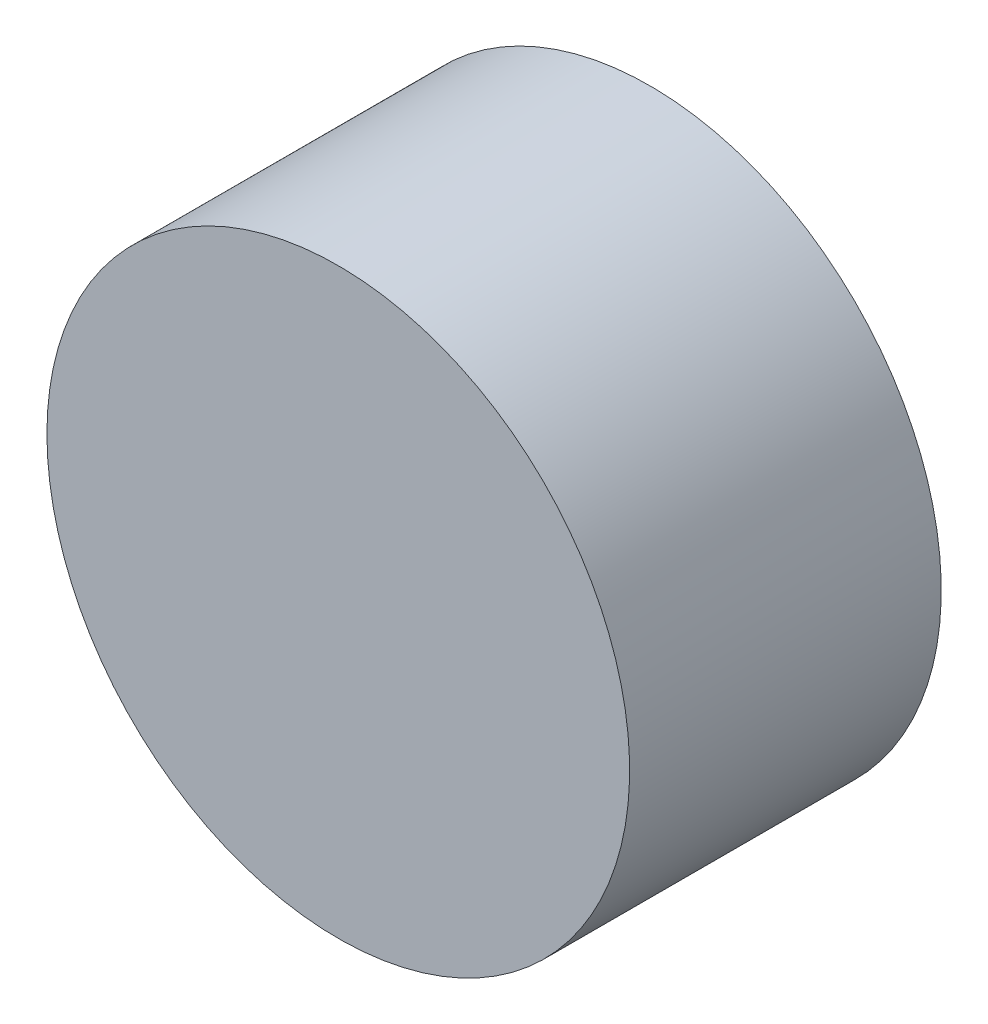
ISO-10303-21;
HEADER;
FILE_DESCRIPTION(('STEP AP214'),'2;1');
FILE_NAME('part.step','',(''),(''),'','','');
FILE_SCHEMA(('AUTOMOTIVE_DESIGN { 1 0 10303 214 1 1 1 1 }'));
ENDSEC;
DATA;
#1=APPLICATION_CONTEXT('core data for automotive mechanical design processes');
#2=APPLICATION_PROTOCOL_DEFINITION('international standard','automotive_design',2000,#1);
#3=PRODUCT_CONTEXT('',#1,'mechanical');
#4=PRODUCT('Part','Part','',(#3));
#5=PRODUCT_RELATED_PRODUCT_CATEGORY('part','',(#4));
#6=PRODUCT_DEFINITION_FORMATION('','',#4);
#7=PRODUCT_DEFINITION_CONTEXT('part definition',#1,'design');
#8=PRODUCT_DEFINITION('design','',#6,#7);
#9=PRODUCT_DEFINITION_SHAPE('','',#8);
#10=(LENGTH_UNIT() NAMED_UNIT(*) SI_UNIT(.MILLI.,.METRE.));
#11=(NAMED_UNIT(*) PLANE_ANGLE_UNIT() SI_UNIT($,.RADIAN.));
#12=(NAMED_UNIT(*) SI_UNIT($,.STERADIAN.) SOLID_ANGLE_UNIT());
#13=UNCERTAINTY_MEASURE_WITH_UNIT(LENGTH_MEASURE(1.E-05),#10,'distance_accuracy_value','');
#14=(GEOMETRIC_REPRESENTATION_CONTEXT(3) GLOBAL_UNCERTAINTY_ASSIGNED_CONTEXT((#13)) GLOBAL_UNIT_ASSIGNED_CONTEXT((#10,
#11,#12)) REPRESENTATION_CONTEXT('',''));
#15=CARTESIAN_POINT('',(0.,0.,0.));
#16=DIRECTION('',(0.,0.,1.));
#17=DIRECTION('',(1.,0.,0.));
#18=AXIS2_PLACEMENT_3D('',#15,#16,#17);
#19=CARTESIAN_POINT('',(0.,0.,45.));
#20=DIRECTION('',(0.,0.,-1.));
#21=DIRECTION('',(-1.,0.,0.));
#22=AXIS2_PLACEMENT_3D('',#19,#20,#21);
#23=CYLINDRICAL_SURFACE('',#22,42.075);
#24=CARTESIAN_POINT('',(0.,0.,45.));
#25=DIRECTION('',(0.,0.,1.));
#26=DIRECTION('',(1.,0.,0.));
#27=AXIS2_PLACEMENT_3D('',#24,#25,#26);
#28=CIRCLE('',#27,42.075);
#29=CARTESIAN_POINT('',(-42.075,0.,45.));
#30=VERTEX_POINT('',#29);
#31=EDGE_CURVE('E10',#30,#30,#28,.T.);
#32=CARTESIAN_POINT('',(0.,0.,0.));
#33=DIRECTION('',(0.,0.,1.));
#34=DIRECTION('',(1.,0.,0.));
#35=AXIS2_PLACEMENT_3D('',#32,#33,#34);
#36=CIRCLE('',#35,42.075);
#37=CARTESIAN_POINT('',(-42.075,0.,0.));
#38=VERTEX_POINT('',#37);
#39=EDGE_CURVE('E40',#38,#38,#36,.T.);
#40=CARTESIAN_POINT('',(-42.075,0.,45.));
#41=CARTESIAN_POINT('',(-42.075,0.,44.53125));
#42=CARTESIAN_POINT('',(-42.075,0.,44.0625));
#43=CARTESIAN_POINT('',(-42.075,0.,43.125));
#44=CARTESIAN_POINT('',(-42.075,0.,42.65625));
#45=CARTESIAN_POINT('',(-42.075,0.,41.71875));
#46=CARTESIAN_POINT('',(-42.075,0.,41.25));
#47=CARTESIAN_POINT('',(-42.075,0.,40.3125));
#48=CARTESIAN_POINT('',(-42.075,0.,39.84375));
#49=CARTESIAN_POINT('',(-42.075,0.,38.90625));
#50=CARTESIAN_POINT('',(-42.075,0.,38.4375));
#51=CARTESIAN_POINT('',(-42.075,0.,37.5));
#52=CARTESIAN_POINT('',(-42.075,0.,37.03125));
#53=CARTESIAN_POINT('',(-42.075,0.,36.09375));
#54=CARTESIAN_POINT('',(-42.075,0.,35.625));
#55=CARTESIAN_POINT('',(-42.075,0.,34.6875));
#56=CARTESIAN_POINT('',(-42.075,0.,34.21875));
#57=CARTESIAN_POINT('',(-42.075,0.,33.28125));
#58=CARTESIAN_POINT('',(-42.075,0.,32.8125));
#59=CARTESIAN_POINT('',(-42.075,0.,31.875));
#60=CARTESIAN_POINT('',(-42.075,0.,31.40625));
#61=CARTESIAN_POINT('',(-42.075,0.,30.46875));
#62=CARTESIAN_POINT('',(-42.075,0.,30.));
#63=CARTESIAN_POINT('',(-42.075,0.,29.0625));
#64=CARTESIAN_POINT('',(-42.075,0.,28.59375));
#65=CARTESIAN_POINT('',(-42.075,0.,27.65625));
#66=CARTESIAN_POINT('',(-42.075,0.,27.1875));
#67=CARTESIAN_POINT('',(-42.075,0.,26.25));
#68=CARTESIAN_POINT('',(-42.075,0.,25.78125));
#69=CARTESIAN_POINT('',(-42.075,0.,24.84375));
#70=CARTESIAN_POINT('',(-42.075,0.,24.375));
#71=CARTESIAN_POINT('',(-42.075,0.,23.4375));
#72=CARTESIAN_POINT('',(-42.075,0.,22.96875));
#73=CARTESIAN_POINT('',(-42.075,0.,22.03125));
#74=CARTESIAN_POINT('',(-42.075,0.,21.5625));
#75=CARTESIAN_POINT('',(-42.075,0.,20.625));
#76=CARTESIAN_POINT('',(-42.075,0.,20.15625));
#77=CARTESIAN_POINT('',(-42.075,0.,19.21875));
#78=CARTESIAN_POINT('',(-42.075,0.,18.75));
#79=CARTESIAN_POINT('',(-42.075,0.,17.8125));
#80=CARTESIAN_POINT('',(-42.075,0.,17.34375));
#81=CARTESIAN_POINT('',(-42.075,0.,16.40625));
#82=CARTESIAN_POINT('',(-42.075,0.,15.9375));
#83=CARTESIAN_POINT('',(-42.075,0.,15.));
#84=CARTESIAN_POINT('',(-42.075,0.,14.53125));
#85=CARTESIAN_POINT('',(-42.075,0.,13.59375));
#86=CARTESIAN_POINT('',(-42.075,0.,13.125));
#87=CARTESIAN_POINT('',(-42.075,0.,12.1875));
#88=CARTESIAN_POINT('',(-42.075,0.,11.71875));
#89=CARTESIAN_POINT('',(-42.075,0.,10.78125));
#90=CARTESIAN_POINT('',(-42.075,0.,10.3125));
#91=CARTESIAN_POINT('',(-42.075,0.,9.37499999999999));
#92=CARTESIAN_POINT('',(-42.075,0.,8.90624999999999));
#93=CARTESIAN_POINT('',(-42.075,0.,7.96874999999999));
#94=CARTESIAN_POINT('',(-42.075,0.,7.5));
#95=CARTESIAN_POINT('',(-42.075,0.,6.56249999999999));
#96=CARTESIAN_POINT('',(-42.075,0.,6.09374999999999));
#97=CARTESIAN_POINT('',(-42.075,0.,5.15624999999999));
#98=CARTESIAN_POINT('',(-42.075,0.,4.68749999999999));
#99=CARTESIAN_POINT('',(-42.075,0.,3.74999999999999));
#100=CARTESIAN_POINT('',(-42.075,0.,3.28124999999999));
#101=CARTESIAN_POINT('',(-42.075,0.,2.34374999999999));
#102=CARTESIAN_POINT('',(-42.075,0.,1.87499999999999));
#103=CARTESIAN_POINT('',(-42.075,0.,0.937499999999992));
#104=CARTESIAN_POINT('',(-42.075,0.,0.468749999999993));
#105=CARTESIAN_POINT('',(-42.075,0.,0.));
#106=B_SPLINE_CURVE_WITH_KNOTS('',3,(#40,#41,#42,#43,#44,#45,#46,#47,#48,#49,#50,#51,#52,#53,
#54,#55,#56,#57,#58,#59,#60,#61,#62,#63,#64,#65,#66,#67,#68,#69,#70,#71,#72,#73,#74,#75,#76,#77,
#78,#79,#80,#81,#82,#83,#84,#85,#86,#87,#88,#89,#90,#91,#92,#93,#94,#95,#96,#97,#98,#99,#100,
#101,#102,#103,#104,#105),.UNSPECIFIED.,.F.,.F.,(4,2,2,2,2,2,2,2,2,2,2,2,2,2,2,2,2,2,2,2,2,2,2,
2,2,2,2,2,2,2,2,2,4),(0.,1.40625,2.8125,4.21874999999999,5.625,7.03125,8.43749999999999,9.84375,
11.25,12.65625,14.0625,15.46875,16.875,18.28125,19.6875,21.09375,22.5,23.90625,25.3125,26.71875,
28.125,29.53125,30.9375,32.34375,33.75,35.15625,36.5625,37.96875,39.375,40.78125,42.1875,
43.59375,45.),.UNSPECIFIED.);
#107=EDGE_CURVE('BSEAM37',#30,#38,#106,.T.);
#108=ORIENTED_EDGE('',*,*,#31,.F.);
#109=ORIENTED_EDGE('',*,*,#39,.T.);
#110=ORIENTED_EDGE('',*,*,#107,.T.);
#111=ORIENTED_EDGE('',*,*,#107,.F.);
#112=EDGE_LOOP('',(#108,#110,#109,#111));
#113=FACE_BOUND('',#112,.T.);
#114=ADVANCED_FACE('F37',(#113),#23,.T.);
#115=CARTESIAN_POINT('',(0.,0.,45.));
#116=DIRECTION('',(0.,0.,1.));
#117=DIRECTION('',(1.,0.,0.));
#118=AXIS2_PLACEMENT_3D('',#115,#116,#117);
#119=PLANE('',#118);
#120=ORIENTED_EDGE('',*,*,#31,.T.);
#121=EDGE_LOOP('',(#120));
#122=FACE_BOUND('',#121,.T.);
#123=ADVANCED_FACE('F54',(#122),#119,.T.);
#124=CARTESIAN_POINT('',(0.,0.,0.));
#125=DIRECTION('',(0.,0.,1.));
#126=DIRECTION('',(1.,0.,0.));
#127=AXIS2_PLACEMENT_3D('',#124,#125,#126);
#128=PLANE('',#127);
#129=ORIENTED_EDGE('',*,*,#39,.F.);
#130=EDGE_LOOP('',(#129));
#131=FACE_BOUND('',#130,.T.);
#132=ADVANCED_FACE('F52',(#131),#128,.F.);
#133=CLOSED_SHELL('',(#114,#123,#132));
#134=MANIFOLD_SOLID_BREP('B2',#133);
#135=ADVANCED_BREP_SHAPE_REPRESENTATION('',(#18,#134),#14);
#136=SHAPE_DEFINITION_REPRESENTATION(#9,#135);
ENDSEC;
END-ISO-10303-21;
